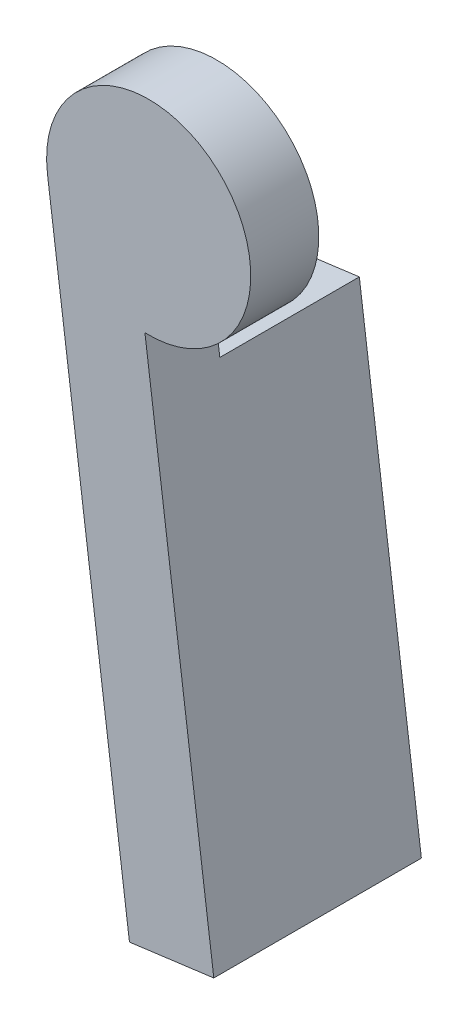
ISO-10303-21;
HEADER;
FILE_DESCRIPTION(('STEP AP214'),'2;1');
FILE_NAME('part.step','',(''),(''),'','','');
FILE_SCHEMA(('AUTOMOTIVE_DESIGN { 1 0 10303 214 1 1 1 1 }'));
ENDSEC;
DATA;
#1=APPLICATION_CONTEXT('core data for automotive mechanical design processes');
#2=APPLICATION_PROTOCOL_DEFINITION('international standard','automotive_design',2000,#1);
#3=PRODUCT_CONTEXT('',#1,'mechanical');
#4=PRODUCT('Part','Part','',(#3));
#5=PRODUCT_RELATED_PRODUCT_CATEGORY('part','',(#4));
#6=PRODUCT_DEFINITION_FORMATION('','',#4);
#7=PRODUCT_DEFINITION_CONTEXT('part definition',#1,'design');
#8=PRODUCT_DEFINITION('design','',#6,#7);
#9=PRODUCT_DEFINITION_SHAPE('','',#8);
#10=(LENGTH_UNIT() NAMED_UNIT(*) SI_UNIT(.MILLI.,.METRE.));
#11=(NAMED_UNIT(*) PLANE_ANGLE_UNIT() SI_UNIT($,.RADIAN.));
#12=(NAMED_UNIT(*) SI_UNIT($,.STERADIAN.) SOLID_ANGLE_UNIT());
#13=UNCERTAINTY_MEASURE_WITH_UNIT(LENGTH_MEASURE(1.E-05),#10,'distance_accuracy_value','');
#14=(GEOMETRIC_REPRESENTATION_CONTEXT(3) GLOBAL_UNCERTAINTY_ASSIGNED_CONTEXT((#13)) GLOBAL_UNIT_ASSIGNED_CONTEXT((#10,
#11,#12)) REPRESENTATION_CONTEXT('',''));
#15=CARTESIAN_POINT('',(0.,0.,0.));
#16=DIRECTION('',(0.,0.,1.));
#17=DIRECTION('',(1.,0.,0.));
#18=AXIS2_PLACEMENT_3D('',#15,#16,#17);
#19=CARTESIAN_POINT('',(0.,0.,0.));
#20=DIRECTION('',(0.,0.,1.));
#21=DIRECTION('',(1.,0.,0.));
#22=AXIS2_PLACEMENT_3D('',#19,#20,#21);
#23=PLANE('',#22);
#24=DIRECTION('',(0.991482168943154,0.130242499468414,0.));
#25=VECTOR('',#24,1.);
#26=CARTESIAN_POINT('',(-15.1660558960572,-30.8127225924239,0.));
#27=LINE('',#26,#25);
#28=CARTESIAN_POINT('',(-15.1660558960571,-30.8127225924239,0.));
#29=VERTEX_POINT('',#28);
#30=CARTESIAN_POINT('',(0.573723535915385,-28.7451229133628,0.));
#31=VERTEX_POINT('',#30);
#32=EDGE_CURVE('E50',#29,#31,#27,.T.);
#33=ORIENTED_EDGE('',*,*,#32,.F.);
#34=DIRECTION('',(-0.130242499468415,0.991482168943154,0.));
#35=VECTOR('',#34,1.);
#36=CARTESIAN_POINT('',(-18.8877353183671,-2.4811196148733,0.));
#37=LINE('',#36,#35);
#38=CARTESIAN_POINT('',(-18.8877353183671,-2.4811196148733,0.));
#39=VERTEX_POINT('',#38);
#40=EDGE_CURVE('E109',#29,#39,#37,.T.);
#41=ORIENTED_EDGE('',*,*,#40,.T.);
#42=CARTESIAN_POINT('',(0.,0.,0.));
#43=DIRECTION('',(0.,0.,1.));
#44=DIRECTION('',(1.,0.,0.));
#45=AXIS2_PLACEMENT_3D('',#42,#43,#44);
#46=CIRCLE('',#45,19.05);
#47=CARTESIAN_POINT('',(-0.701538954227206,-19.0370781134002,0.));
#48=VERTEX_POINT('',#47);
#49=EDGE_CURVE('E42',#48,#39,#46,.T.);
#50=ORIENTED_EDGE('',*,*,#49,.F.);
#51=DIRECTION('',(0.130242499468414,-0.991482168943154,0.));
#52=VECTOR('',#51,1.);
#53=CARTESIAN_POINT('',(12.1522817386575,-116.887887732409,0.));
#54=LINE('',#53,#52);
#55=EDGE_CURVE('E128',#48,#31,#54,.T.);
#56=ORIENTED_EDGE('',*,*,#55,.T.);
#57=EDGE_LOOP('',(#33,#41,#50,#56));
#58=FACE_BOUND('',#57,.T.);
#59=ADVANCED_FACE('F33',(#58),#23,.F.);
#60=CARTESIAN_POINT('',(0.,0.,12.7));
#61=DIRECTION('',(0.,0.,-1.));
#62=DIRECTION('',(-1.,0.,0.));
#63=AXIS2_PLACEMENT_3D('',#60,#61,#62);
#64=CYLINDRICAL_SURFACE('',#63,19.05);
#65=CARTESIAN_POINT('',(0.,0.,12.7));
#66=DIRECTION('',(0.,0.,1.));
#67=DIRECTION('',(1.,0.,0.));
#68=AXIS2_PLACEMENT_3D('',#65,#66,#67);
#69=CIRCLE('',#68,19.05);
#70=CARTESIAN_POINT('',(-0.701538954227207,-19.0370781134002,12.7));
#71=VERTEX_POINT('',#70);
#72=CARTESIAN_POINT('',(-18.8877353183671,-2.4811196148733,12.7));
#73=VERTEX_POINT('',#72);
#74=EDGE_CURVE('E11',#71,#73,#69,.T.);
#75=ORIENTED_EDGE('',*,*,#74,.F.);
#76=DIRECTION('',(0.,0.,1.));
#77=VECTOR('',#76,1.);
#78=CARTESIAN_POINT('',(-0.701538954227206,-19.0370781134002,-120.539458321818));
#79=LINE('',#78,#77);
#80=EDGE_CURVE('E130',#48,#71,#79,.T.);
#81=ORIENTED_EDGE('',*,*,#80,.F.);
#82=ORIENTED_EDGE('',*,*,#49,.T.);
#83=DIRECTION('',(0.,0.,1.));
#84=VECTOR('',#83,1.);
#85=CARTESIAN_POINT('',(-18.8877353183671,-2.4811196148733,-120.539458321818));
#86=LINE('',#85,#84);
#87=EDGE_CURVE('E134',#39,#73,#86,.T.);
#88=ORIENTED_EDGE('',*,*,#87,.T.);
#89=EDGE_LOOP('',(#75,#81,#82,#88));
#90=FACE_BOUND('',#89,.T.);
#91=ADVANCED_FACE('F35',(#90),#64,.T.);
#92=CARTESIAN_POINT('',(0.,0.,12.7));
#93=DIRECTION('',(0.,0.,1.));
#94=DIRECTION('',(1.,0.,0.));
#95=AXIS2_PLACEMENT_3D('',#92,#93,#94);
#96=PLANE('',#95);
#97=ORIENTED_EDGE('',*,*,#74,.T.);
#98=DIRECTION('',(0.130242499468415,-0.991482168943153,0.));
#99=VECTOR('',#98,1.);
#100=CARTESIAN_POINT('',(-18.8877353183671,-2.4811196148733,12.7));
#101=LINE('',#100,#99);
#102=CARTESIAN_POINT('',(-3.58749769331508,-118.95548741147,12.7));
#103=VERTEX_POINT('',#102);
#104=EDGE_CURVE('E110',#73,#103,#101,.T.);
#105=ORIENTED_EDGE('',*,*,#104,.T.);
#106=DIRECTION('',(0.991482168943154,0.130242499468414,0.));
#107=VECTOR('',#106,1.);
#108=CARTESIAN_POINT('',(-3.58749769331508,-118.95548741147,12.7));
#109=LINE('',#108,#107);
#110=CARTESIAN_POINT('',(12.1522817386575,-116.887887732409,12.7));
#111=VERTEX_POINT('',#110);
#112=EDGE_CURVE('E112',#103,#111,#109,.T.);
#113=ORIENTED_EDGE('',*,*,#112,.T.);
#114=DIRECTION('',(-0.130242499468414,0.991482168943154,0.));
#115=VECTOR('',#114,1.);
#116=CARTESIAN_POINT('',(12.1522817386575,-116.887887732409,12.7));
#117=LINE('',#116,#115);
#118=EDGE_CURVE('E137',#111,#71,#117,.T.);
#119=ORIENTED_EDGE('',*,*,#118,.T.);
#120=EDGE_LOOP('',(#97,#105,#113,#119));
#121=FACE_BOUND('',#120,.T.);
#122=ADVANCED_FACE('F147',(#121),#96,.T.);
#123=CARTESIAN_POINT('',(12.1522817386575,-116.887887732409,-120.539458321818));
#124=DIRECTION('',(0.991482168943153,0.130242499468414,0.));
#125=DIRECTION('',(-0.130242499468414,0.991482168943154,0.));
#126=AXIS2_PLACEMENT_3D('',#123,#124,#125);
#127=PLANE('',#126);
#128=ORIENTED_EDGE('',*,*,#55,.F.);
#129=ORIENTED_EDGE('',*,*,#80,.T.);
#130=ORIENTED_EDGE('',*,*,#118,.F.);
#131=DIRECTION('',(0.,0.,1.));
#132=VECTOR('',#131,1.);
#133=CARTESIAN_POINT('',(12.1522817386575,-116.887887732409,-120.539458321818));
#134=LINE('',#133,#132);
#135=CARTESIAN_POINT('',(12.1522817386575,-116.887887732409,-26.035));
#136=VERTEX_POINT('',#135);
#137=EDGE_CURVE('E139',#136,#111,#134,.T.);
#138=ORIENTED_EDGE('',*,*,#137,.F.);
#139=DIRECTION('',(0.130242499468415,-0.991482168943153,0.));
#140=VECTOR('',#139,1.);
#141=CARTESIAN_POINT('',(12.1522817386575,-116.887887732409,-26.035));
#142=LINE('',#141,#140);
#143=CARTESIAN_POINT('',(0.573723535915385,-28.7451229133628,-26.035));
#144=VERTEX_POINT('',#143);
#145=EDGE_CURVE('E97',#144,#136,#142,.T.);
#146=ORIENTED_EDGE('',*,*,#145,.F.);
#147=DIRECTION('',(0.,0.,1.));
#148=VECTOR('',#147,1.);
#149=CARTESIAN_POINT('',(0.573723535915385,-28.7451229133628,-26.035));
#150=LINE('',#149,#148);
#151=EDGE_CURVE('E93',#144,#31,#150,.T.);
#152=ORIENTED_EDGE('',*,*,#151,.T.);
#153=EDGE_LOOP('',(#128,#129,#130,#138,#146,#152));
#154=FACE_BOUND('',#153,.T.);
#155=ADVANCED_FACE('F152',(#154),#127,.T.);
#156=CARTESIAN_POINT('',(-3.58749769331508,-118.95548741147,-120.539458321818));
#157=DIRECTION('',(0.130242499468414,-0.991482168943153,0.));
#158=DIRECTION('',(0.991482168943154,0.130242499468414,0.));
#159=AXIS2_PLACEMENT_3D('',#156,#157,#158);
#160=PLANE('',#159);
#161=DIRECTION('',(0.,0.,1.));
#162=VECTOR('',#161,1.);
#163=CARTESIAN_POINT('',(-3.58749769331508,-118.95548741147,-120.539458321818));
#164=LINE('',#163,#162);
#165=CARTESIAN_POINT('',(-3.58749769331508,-118.95548741147,-26.035));
#166=VERTEX_POINT('',#165);
#167=EDGE_CURVE('E136',#166,#103,#164,.T.);
#168=ORIENTED_EDGE('',*,*,#167,.F.);
#169=DIRECTION('',(-0.991482168943154,-0.130242499468414,0.));
#170=VECTOR('',#169,1.);
#171=CARTESIAN_POINT('',(-3.58749769331508,-118.95548741147,-26.035));
#172=LINE('',#171,#170);
#173=EDGE_CURVE('E104',#136,#166,#172,.T.);
#174=ORIENTED_EDGE('',*,*,#173,.F.);
#175=ORIENTED_EDGE('',*,*,#137,.T.);
#176=ORIENTED_EDGE('',*,*,#112,.F.);
#177=EDGE_LOOP('',(#168,#174,#175,#176));
#178=FACE_BOUND('',#177,.T.);
#179=ADVANCED_FACE('F153',(#178),#160,.T.);
#180=CARTESIAN_POINT('',(-18.8877353183671,-2.4811196148733,-120.539458321818));
#181=DIRECTION('',(-0.991482168943153,-0.130242499468415,0.));
#182=DIRECTION('',(0.130242499468415,-0.991482168943154,0.));
#183=AXIS2_PLACEMENT_3D('',#180,#181,#182);
#184=PLANE('',#183);
#185=ORIENTED_EDGE('',*,*,#40,.F.);
#186=DIRECTION('',(0.,0.,1.));
#187=VECTOR('',#186,1.);
#188=CARTESIAN_POINT('',(-15.1660558960572,-30.8127225924239,-26.035));
#189=LINE('',#188,#187);
#190=CARTESIAN_POINT('',(-15.1660558960572,-30.8127225924239,-26.035));
#191=VERTEX_POINT('',#190);
#192=EDGE_CURVE('E91',#191,#29,#189,.T.);
#193=ORIENTED_EDGE('',*,*,#192,.F.);
#194=DIRECTION('',(-0.130242499468415,0.991482168943153,0.));
#195=VECTOR('',#194,1.);
#196=CARTESIAN_POINT('',(-3.58749769331508,-118.95548741147,-26.035));
#197=LINE('',#196,#195);
#198=EDGE_CURVE('E98',#166,#191,#197,.T.);
#199=ORIENTED_EDGE('',*,*,#198,.F.);
#200=ORIENTED_EDGE('',*,*,#167,.T.);
#201=ORIENTED_EDGE('',*,*,#104,.F.);
#202=ORIENTED_EDGE('',*,*,#87,.F.);
#203=EDGE_LOOP('',(#185,#193,#199,#200,#201,#202));
#204=FACE_BOUND('',#203,.T.);
#205=ADVANCED_FACE('F107',(#204),#184,.T.);
#206=CARTESIAN_POINT('',(-15.1660558960572,-30.8127225924239,-26.035));
#207=DIRECTION('',(0.130242499468414,-0.991482168943154,0.));
#208=DIRECTION('',(0.991482168943154,0.130242499468414,0.));
#209=AXIS2_PLACEMENT_3D('',#206,#207,#208);
#210=PLANE('',#209);
#211=ORIENTED_EDGE('',*,*,#32,.T.);
#212=ORIENTED_EDGE('',*,*,#151,.F.);
#213=DIRECTION('',(0.991482168943154,0.130242499468414,0.));
#214=VECTOR('',#213,1.);
#215=CARTESIAN_POINT('',(-15.1660558960572,-30.8127225924239,-26.035));
#216=LINE('',#215,#214);
#217=EDGE_CURVE('E87',#191,#144,#216,.T.);
#218=ORIENTED_EDGE('',*,*,#217,.F.);
#219=ORIENTED_EDGE('',*,*,#192,.T.);
#220=EDGE_LOOP('',(#211,#212,#218,#219));
#221=FACE_BOUND('',#220,.T.);
#222=ADVANCED_FACE('F89',(#221),#210,.F.);
#223=CARTESIAN_POINT('',(0.,0.,-26.035));
#224=DIRECTION('',(0.,0.,-1.));
#225=DIRECTION('',(-1.,0.,0.));
#226=AXIS2_PLACEMENT_3D('',#223,#224,#225);
#227=PLANE('',#226);
#228=ORIENTED_EDGE('',*,*,#198,.T.);
#229=ORIENTED_EDGE('',*,*,#217,.T.);
#230=ORIENTED_EDGE('',*,*,#145,.T.);
#231=ORIENTED_EDGE('',*,*,#173,.T.);
#232=EDGE_LOOP('',(#228,#229,#230,#231));
#233=FACE_BOUND('',#232,.T.);
#234=ADVANCED_FACE('F102',(#233),#227,.T.);
#235=CLOSED_SHELL('',(#59,#91,#122,#155,#179,#205,#222,#234));
#236=MANIFOLD_SOLID_BREP('B2',#235);
#237=ADVANCED_BREP_SHAPE_REPRESENTATION('',(#18,#236),#14);
#238=SHAPE_DEFINITION_REPRESENTATION(#9,#237);
ENDSEC;
END-ISO-10303-21;
